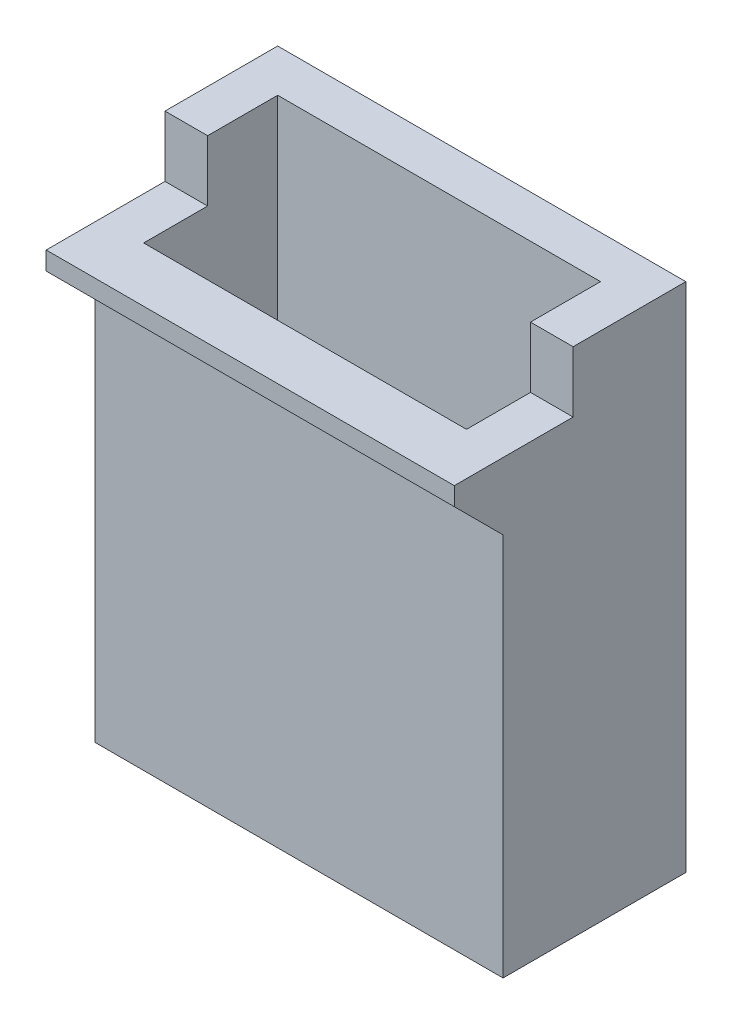
ISO-10303-21;
HEADER;
FILE_DESCRIPTION(('STEP AP214'),'2;1');
FILE_NAME('part.step','',(''),(''),'','','');
FILE_SCHEMA(('AUTOMOTIVE_DESIGN { 1 0 10303 214 1 1 1 1 }'));
ENDSEC;
DATA;
#1=APPLICATION_CONTEXT('core data for automotive mechanical design processes');
#2=APPLICATION_PROTOCOL_DEFINITION('international standard','automotive_design',2000,#1);
#3=PRODUCT_CONTEXT('',#1,'mechanical');
#4=PRODUCT('Part','Part','',(#3));
#5=PRODUCT_RELATED_PRODUCT_CATEGORY('part','',(#4));
#6=PRODUCT_DEFINITION_FORMATION('','',#4);
#7=PRODUCT_DEFINITION_CONTEXT('part definition',#1,'design');
#8=PRODUCT_DEFINITION('design','',#6,#7);
#9=PRODUCT_DEFINITION_SHAPE('','',#8);
#10=(LENGTH_UNIT() NAMED_UNIT(*) SI_UNIT(.MILLI.,.METRE.));
#11=(NAMED_UNIT(*) PLANE_ANGLE_UNIT() SI_UNIT($,.RADIAN.));
#12=(NAMED_UNIT(*) SI_UNIT($,.STERADIAN.) SOLID_ANGLE_UNIT());
#13=UNCERTAINTY_MEASURE_WITH_UNIT(LENGTH_MEASURE(1.E-05),#10,'distance_accuracy_value','');
#14=(GEOMETRIC_REPRESENTATION_CONTEXT(3) GLOBAL_UNCERTAINTY_ASSIGNED_CONTEXT((#13)) GLOBAL_UNIT_ASSIGNED_CONTEXT((#10,
#11,#12)) REPRESENTATION_CONTEXT('',''));
#15=CARTESIAN_POINT('',(0.,0.,0.));
#16=DIRECTION('',(0.,0.,1.));
#17=DIRECTION('',(1.,0.,0.));
#18=AXIS2_PLACEMENT_3D('',#15,#16,#17);
#19=CARTESIAN_POINT('',(0.,0.,-1.5));
#20=DIRECTION('',(0.,0.,1.));
#21=DIRECTION('',(1.,0.,0.));
#22=AXIS2_PLACEMENT_3D('',#19,#20,#21);
#23=PLANE('',#22);
#24=DIRECTION('',(-1.,0.,0.));
#25=VECTOR('',#24,1.);
#26=CARTESIAN_POINT('',(3.35,4.2,-1.5));
#27=LINE('',#26,#25);
#28=CARTESIAN_POINT('',(3.35,4.2,-1.5));
#29=VERTEX_POINT('',#28);
#30=CARTESIAN_POINT('',(-3.35,4.2,-1.5));
#31=VERTEX_POINT('',#30);
#32=EDGE_CURVE('E36',#29,#31,#27,.T.);
#33=ORIENTED_EDGE('',*,*,#32,.F.);
#34=DIRECTION('',(0.,1.,0.));
#35=VECTOR('',#34,1.);
#36=CARTESIAN_POINT('',(3.35,-4.2,-1.5));
#37=LINE('',#36,#35);
#38=CARTESIAN_POINT('',(3.35,-4.2,-1.5));
#39=VERTEX_POINT('',#38);
#40=EDGE_CURVE('E269',#39,#29,#37,.T.);
#41=ORIENTED_EDGE('',*,*,#40,.F.);
#42=DIRECTION('',(1.,0.,0.));
#43=VECTOR('',#42,1.);
#44=CARTESIAN_POINT('',(-3.35,-4.2,-1.5));
#45=LINE('',#44,#43);
#46=CARTESIAN_POINT('',(-3.35,-4.2,-1.5));
#47=VERTEX_POINT('',#46);
#48=EDGE_CURVE('E237',#47,#39,#45,.T.);
#49=ORIENTED_EDGE('',*,*,#48,.F.);
#50=DIRECTION('',(0.,-1.,0.));
#51=VECTOR('',#50,1.);
#52=CARTESIAN_POINT('',(-3.35,4.2,-1.5));
#53=LINE('',#52,#51);
#54=EDGE_CURVE('E11',#31,#47,#53,.T.);
#55=ORIENTED_EDGE('',*,*,#54,.F.);
#56=EDGE_LOOP('',(#33,#41,#49,#55));
#57=FACE_BOUND('',#56,.T.);
#58=ADVANCED_FACE('F17',(#57),#23,.F.);
#59=CARTESIAN_POINT('',(-3.35,4.2,-1.5));
#60=DIRECTION('',(-1.,0.,0.));
#61=DIRECTION('',(0.,-1.,0.));
#62=AXIS2_PLACEMENT_3D('',#59,#60,#61);
#63=PLANE('',#62);
#64=DIRECTION('',(0.,-1.,0.));
#65=VECTOR('',#64,1.);
#66=CARTESIAN_POINT('',(-3.35,4.2,0.35));
#67=LINE('',#66,#65);
#68=CARTESIAN_POINT('',(-3.35,4.2,0.35));
#69=VERTEX_POINT('',#68);
#70=CARTESIAN_POINT('',(-3.35,3.2,0.35));
#71=VERTEX_POINT('',#70);
#72=EDGE_CURVE('E199',#69,#71,#67,.T.);
#73=ORIENTED_EDGE('',*,*,#72,.F.);
#74=DIRECTION('',(0.,0.,1.));
#75=VECTOR('',#74,1.);
#76=CARTESIAN_POINT('',(-3.35,4.2,-1.5));
#77=LINE('',#76,#75);
#78=EDGE_CURVE('E297',#31,#69,#77,.T.);
#79=ORIENTED_EDGE('',*,*,#78,.F.);
#80=ORIENTED_EDGE('',*,*,#54,.T.);
#81=DIRECTION('',(0.,0.,1.));
#82=VECTOR('',#81,1.);
#83=CARTESIAN_POINT('',(-3.35,-4.2,-1.5));
#84=LINE('',#83,#82);
#85=CARTESIAN_POINT('',(-3.35,-4.2,1.5));
#86=VERTEX_POINT('',#85);
#87=EDGE_CURVE('E27',#47,#86,#84,.T.);
#88=ORIENTED_EDGE('',*,*,#87,.T.);
#89=DIRECTION('',(0.,-1.,0.));
#90=VECTOR('',#89,1.);
#91=CARTESIAN_POINT('',(-3.35,2.1,1.5));
#92=LINE('',#91,#90);
#93=CARTESIAN_POINT('',(-3.35,2.1,1.5));
#94=VERTEX_POINT('',#93);
#95=EDGE_CURVE('E240',#94,#86,#92,.T.);
#96=ORIENTED_EDGE('',*,*,#95,.F.);
#97=DIRECTION('',(0.,-0.707106781186548,-0.707106781186548));
#98=VECTOR('',#97,1.);
#99=CARTESIAN_POINT('',(-3.35,2.9,2.3));
#100=LINE('',#99,#98);
#101=CARTESIAN_POINT('',(-3.35,2.9,2.3));
#102=VERTEX_POINT('',#101);
#103=EDGE_CURVE('E254',#102,#94,#100,.T.);
#104=ORIENTED_EDGE('',*,*,#103,.F.);
#105=DIRECTION('',(0.,-1.,0.));
#106=VECTOR('',#105,1.);
#107=CARTESIAN_POINT('',(-3.35,3.2,2.3));
#108=LINE('',#107,#106);
#109=CARTESIAN_POINT('',(-3.35,3.2,2.3));
#110=VERTEX_POINT('',#109);
#111=EDGE_CURVE('E314',#110,#102,#108,.T.);
#112=ORIENTED_EDGE('',*,*,#111,.F.);
#113=DIRECTION('',(0.,0.,1.));
#114=VECTOR('',#113,1.);
#115=CARTESIAN_POINT('',(-3.35,3.2,0.35));
#116=LINE('',#115,#114);
#117=EDGE_CURVE('E316',#71,#110,#116,.T.);
#118=ORIENTED_EDGE('',*,*,#117,.F.);
#119=EDGE_LOOP('',(#73,#79,#80,#88,#96,#104,#112,#118));
#120=FACE_BOUND('',#119,.T.);
#121=ADVANCED_FACE('F410',(#120),#63,.T.);
#122=CARTESIAN_POINT('',(3.35,3.2,1.5));
#123=DIRECTION('',(0.,-1.,0.));
#124=DIRECTION('',(0.,0.,-1.));
#125=AXIS2_PLACEMENT_3D('',#122,#123,#124);
#126=PLANE('',#125);
#127=DIRECTION('',(0.,0.,-1.));
#128=VECTOR('',#127,1.);
#129=CARTESIAN_POINT('',(-2.65,3.2,1.4));
#130=LINE('',#129,#128);
#131=CARTESIAN_POINT('',(-2.65,3.2,1.4));
#132=VERTEX_POINT('',#131);
#133=CARTESIAN_POINT('',(-2.65,3.2,0.35));
#134=VERTEX_POINT('',#133);
#135=EDGE_CURVE('E311',#132,#134,#130,.T.);
#136=ORIENTED_EDGE('',*,*,#135,.T.);
#137=DIRECTION('',(-1.,0.,0.));
#138=VECTOR('',#137,1.);
#139=CARTESIAN_POINT('',(-2.65,3.2,0.35));
#140=LINE('',#139,#138);
#141=EDGE_CURVE('E319',#134,#71,#140,.T.);
#142=ORIENTED_EDGE('',*,*,#141,.T.);
#143=ORIENTED_EDGE('',*,*,#117,.T.);
#144=DIRECTION('',(-1.,0.,0.));
#145=VECTOR('',#144,1.);
#146=CARTESIAN_POINT('',(3.35,3.2,2.3));
#147=LINE('',#146,#145);
#148=CARTESIAN_POINT('',(3.35,3.2,2.3));
#149=VERTEX_POINT('',#148);
#150=EDGE_CURVE('E255',#149,#110,#147,.T.);
#151=ORIENTED_EDGE('',*,*,#150,.F.);
#152=DIRECTION('',(0.,0.,1.));
#153=VECTOR('',#152,1.);
#154=CARTESIAN_POINT('',(3.35,3.2,0.35));
#155=LINE('',#154,#153);
#156=CARTESIAN_POINT('',(3.35,3.2,0.35));
#157=VERTEX_POINT('',#156);
#158=EDGE_CURVE('E264',#157,#149,#155,.T.);
#159=ORIENTED_EDGE('',*,*,#158,.F.);
#160=DIRECTION('',(-1.,0.,0.));
#161=VECTOR('',#160,1.);
#162=CARTESIAN_POINT('',(3.35,3.2,0.35));
#163=LINE('',#162,#161);
#164=CARTESIAN_POINT('',(2.65,3.2,0.35));
#165=VERTEX_POINT('',#164);
#166=EDGE_CURVE('E320',#157,#165,#163,.T.);
#167=ORIENTED_EDGE('',*,*,#166,.T.);
#168=DIRECTION('',(0.,0.,1.));
#169=VECTOR('',#168,1.);
#170=CARTESIAN_POINT('',(2.65,3.2,0.35));
#171=LINE('',#170,#169);
#172=CARTESIAN_POINT('',(2.65,3.2,1.4));
#173=VERTEX_POINT('',#172);
#174=EDGE_CURVE('E330',#165,#173,#171,.T.);
#175=ORIENTED_EDGE('',*,*,#174,.T.);
#176=DIRECTION('',(1.,0.,0.));
#177=VECTOR('',#176,1.);
#178=CARTESIAN_POINT('',(-2.65,3.2,1.4));
#179=LINE('',#178,#177);
#180=EDGE_CURVE('E334',#132,#173,#179,.T.);
#181=ORIENTED_EDGE('',*,*,#180,.F.);
#182=EDGE_LOOP('',(#136,#142,#143,#151,#159,#167,#175,#181));
#183=FACE_BOUND('',#182,.T.);
#184=ADVANCED_FACE('F422',(#183),#126,.F.);
#185=CARTESIAN_POINT('',(0.,2.9,1.1));
#186=DIRECTION('',(0.,0.707106781186548,-0.707106781186548));
#187=DIRECTION('',(0.,0.707106781186548,0.707106781186548));
#188=AXIS2_PLACEMENT_3D('',#185,#186,#187);
#189=PLANE('',#188);
#190=DIRECTION('',(0.,-0.707106781186548,-0.707106781186548));
#191=VECTOR('',#190,1.);
#192=CARTESIAN_POINT('',(2.65,3.2,1.4));
#193=LINE('',#192,#191);
#194=CARTESIAN_POINT('',(2.65,2.6,0.8));
#195=VERTEX_POINT('',#194);
#196=EDGE_CURVE('E333',#173,#195,#193,.T.);
#197=ORIENTED_EDGE('',*,*,#196,.T.);
#198=DIRECTION('',(1.,0.,0.));
#199=VECTOR('',#198,1.);
#200=CARTESIAN_POINT('',(-2.65,2.6,0.8));
#201=LINE('',#200,#199);
#202=CARTESIAN_POINT('',(-2.65,2.6,0.8));
#203=VERTEX_POINT('',#202);
#204=EDGE_CURVE('E340',#203,#195,#201,.T.);
#205=ORIENTED_EDGE('',*,*,#204,.F.);
#206=DIRECTION('',(0.,0.707106781186548,0.707106781186548));
#207=VECTOR('',#206,1.);
#208=CARTESIAN_POINT('',(-2.65,2.6,0.8));
#209=LINE('',#208,#207);
#210=EDGE_CURVE('E336',#203,#132,#209,.T.);
#211=ORIENTED_EDGE('',*,*,#210,.T.);
#212=ORIENTED_EDGE('',*,*,#180,.T.);
#213=EDGE_LOOP('',(#197,#205,#211,#212));
#214=FACE_BOUND('',#213,.T.);
#215=ADVANCED_FACE('F420',(#214),#189,.T.);
#216=CARTESIAN_POINT('',(-2.65,4.2,-1.5));
#217=DIRECTION('',(-1.,0.,0.));
#218=DIRECTION('',(0.,-1.,0.));
#219=AXIS2_PLACEMENT_3D('',#216,#217,#218);
#220=PLANE('',#219);
#221=DIRECTION('',(0.,0.,1.));
#222=VECTOR('',#221,1.);
#223=CARTESIAN_POINT('',(-2.65,-3.5,-0.8));
#224=LINE('',#223,#222);
#225=CARTESIAN_POINT('',(-2.65,-3.5,-0.8));
#226=VERTEX_POINT('',#225);
#227=CARTESIAN_POINT('',(-2.65,-3.5,0.8));
#228=VERTEX_POINT('',#227);
#229=EDGE_CURVE('E211',#226,#228,#224,.T.);
#230=ORIENTED_EDGE('',*,*,#229,.F.);
#231=DIRECTION('',(0.,-1.,0.));
#232=VECTOR('',#231,1.);
#233=CARTESIAN_POINT('',(-2.65,4.2,-0.8));
#234=LINE('',#233,#232);
#235=CARTESIAN_POINT('',(-2.65,4.2,-0.8));
#236=VERTEX_POINT('',#235);
#237=EDGE_CURVE('E223',#236,#226,#234,.T.);
#238=ORIENTED_EDGE('',*,*,#237,.F.);
#239=DIRECTION('',(0.,0.,1.));
#240=VECTOR('',#239,1.);
#241=CARTESIAN_POINT('',(-2.65,4.2,-0.8));
#242=LINE('',#241,#240);
#243=CARTESIAN_POINT('',(-2.65,4.2,0.35));
#244=VERTEX_POINT('',#243);
#245=EDGE_CURVE('E337',#236,#244,#242,.T.);
#246=ORIENTED_EDGE('',*,*,#245,.T.);
#247=DIRECTION('',(0.,-1.,0.));
#248=VECTOR('',#247,1.);
#249=CARTESIAN_POINT('',(-2.65,4.2,0.35));
#250=LINE('',#249,#248);
#251=EDGE_CURVE('E350',#244,#134,#250,.T.);
#252=ORIENTED_EDGE('',*,*,#251,.T.);
#253=ORIENTED_EDGE('',*,*,#135,.F.);
#254=ORIENTED_EDGE('',*,*,#210,.F.);
#255=DIRECTION('',(0.,-1.,0.));
#256=VECTOR('',#255,1.);
#257=CARTESIAN_POINT('',(-2.65,2.6,0.8));
#258=LINE('',#257,#256);
#259=EDGE_CURVE('E342',#203,#228,#258,.T.);
#260=ORIENTED_EDGE('',*,*,#259,.T.);
#261=EDGE_LOOP('',(#230,#238,#246,#252,#253,#254,#260));
#262=FACE_BOUND('',#261,.T.);
#263=ADVANCED_FACE('F416',(#262),#220,.F.);
#264=CARTESIAN_POINT('',(0.,0.,0.8));
#265=DIRECTION('',(0.,0.,1.));
#266=DIRECTION('',(1.,0.,0.));
#267=AXIS2_PLACEMENT_3D('',#264,#265,#266);
#268=PLANE('',#267);
#269=ORIENTED_EDGE('',*,*,#259,.F.);
#270=ORIENTED_EDGE('',*,*,#204,.T.);
#271=DIRECTION('',(0.,1.,0.));
#272=VECTOR('',#271,1.);
#273=CARTESIAN_POINT('',(2.65,-3.5,0.8));
#274=LINE('',#273,#272);
#275=CARTESIAN_POINT('',(2.65,-3.5,0.8));
#276=VERTEX_POINT('',#275);
#277=EDGE_CURVE('E287',#276,#195,#274,.T.);
#278=ORIENTED_EDGE('',*,*,#277,.F.);
#279=DIRECTION('',(1.,0.,0.));
#280=VECTOR('',#279,1.);
#281=CARTESIAN_POINT('',(1.4,-3.5,0.8));
#282=LINE('',#281,#280);
#283=CARTESIAN_POINT('',(1.4,-3.5,0.8));
#284=VERTEX_POINT('',#283);
#285=EDGE_CURVE('E294',#284,#276,#282,.T.);
#286=ORIENTED_EDGE('',*,*,#285,.F.);
#287=DIRECTION('',(0.,1.,0.));
#288=VECTOR('',#287,1.);
#289=CARTESIAN_POINT('',(1.4,-4.2,0.8));
#290=LINE('',#289,#288);
#291=CARTESIAN_POINT('',(1.4,-4.2,0.8));
#292=VERTEX_POINT('',#291);
#293=EDGE_CURVE('E245',#292,#284,#290,.T.);
#294=ORIENTED_EDGE('',*,*,#293,.F.);
#295=DIRECTION('',(-1.,0.,0.));
#296=VECTOR('',#295,1.);
#297=CARTESIAN_POINT('',(1.4,-4.2,0.8));
#298=LINE('',#297,#296);
#299=CARTESIAN_POINT('',(-1.4,-4.2,0.8));
#300=VERTEX_POINT('',#299);
#301=EDGE_CURVE('E343',#292,#300,#298,.T.);
#302=ORIENTED_EDGE('',*,*,#301,.T.);
#303=DIRECTION('',(0.,1.,0.));
#304=VECTOR('',#303,1.);
#305=CARTESIAN_POINT('',(-1.4,-4.2,0.8));
#306=LINE('',#305,#304);
#307=CARTESIAN_POINT('',(-1.4,-3.5,0.8));
#308=VERTEX_POINT('',#307);
#309=EDGE_CURVE('E216',#300,#308,#306,.T.);
#310=ORIENTED_EDGE('',*,*,#309,.T.);
#311=DIRECTION('',(1.,0.,0.));
#312=VECTOR('',#311,1.);
#313=CARTESIAN_POINT('',(-2.65,-3.5,0.8));
#314=LINE('',#313,#312);
#315=EDGE_CURVE('E232',#228,#308,#314,.T.);
#316=ORIENTED_EDGE('',*,*,#315,.F.);
#317=EDGE_LOOP('',(#269,#270,#278,#286,#294,#302,#310,#316));
#318=FACE_BOUND('',#317,.T.);
#319=DIRECTION('',(0.,-1.,0.));
#320=VECTOR('',#319,1.);
#321=CARTESIAN_POINT('',(-0.725,0.09999999999996,0.8));
#322=LINE('',#321,#320);
#323=CARTESIAN_POINT('',(-0.725,0.09999999999996,0.8));
#324=VERTEX_POINT('',#323);
#325=CARTESIAN_POINT('',(-0.725,-1.7,0.8));
#326=VERTEX_POINT('',#325);
#327=EDGE_CURVE('E214',#324,#326,#322,.T.);
#328=ORIENTED_EDGE('',*,*,#327,.T.);
#329=DIRECTION('',(1.,0.,0.));
#330=VECTOR('',#329,1.);
#331=CARTESIAN_POINT('',(-0.725,-1.7,0.8));
#332=LINE('',#331,#330);
#333=CARTESIAN_POINT('',(0.725,-1.7,0.8));
#334=VERTEX_POINT('',#333);
#335=EDGE_CURVE('E190',#326,#334,#332,.T.);
#336=ORIENTED_EDGE('',*,*,#335,.T.);
#337=DIRECTION('',(0.,1.,0.));
#338=VECTOR('',#337,1.);
#339=CARTESIAN_POINT('',(0.725,-1.7,0.8));
#340=LINE('',#339,#338);
#341=CARTESIAN_POINT('',(0.725,0.09999999999997,0.8));
#342=VERTEX_POINT('',#341);
#343=EDGE_CURVE('E209',#334,#342,#340,.T.);
#344=ORIENTED_EDGE('',*,*,#343,.T.);
#345=DIRECTION('',(1.,0.,0.));
#346=VECTOR('',#345,1.);
#347=CARTESIAN_POINT('',(-0.725,0.09999999999996,0.8));
#348=LINE('',#347,#346);
#349=EDGE_CURVE('E200',#324,#342,#348,.T.);
#350=ORIENTED_EDGE('',*,*,#349,.F.);
#351=EDGE_LOOP('',(#328,#336,#344,#350));
#352=FACE_BOUND('',#351,.T.);
#353=ADVANCED_FACE('F213',(#318,#352),#268,.F.);
#354=CARTESIAN_POINT('',(-3.35,-3.5,-1.5));
#355=DIRECTION('',(0.,-1.,0.));
#356=DIRECTION('',(1.,0.,0.));
#357=AXIS2_PLACEMENT_3D('',#354,#355,#356);
#358=PLANE('',#357);
#359=DIRECTION('',(1.,0.,0.));
#360=VECTOR('',#359,1.);
#361=CARTESIAN_POINT('',(-2.65,-3.5,-0.8));
#362=LINE('',#361,#360);
#363=CARTESIAN_POINT('',(-1.4,-3.5,-0.8));
#364=VERTEX_POINT('',#363);
#365=EDGE_CURVE('E221',#226,#364,#362,.T.);
#366=ORIENTED_EDGE('',*,*,#365,.F.);
#367=ORIENTED_EDGE('',*,*,#229,.T.);
#368=ORIENTED_EDGE('',*,*,#315,.T.);
#369=DIRECTION('',(0.,0.,1.));
#370=VECTOR('',#369,1.);
#371=CARTESIAN_POINT('',(-1.4,-3.5,-0.8));
#372=LINE('',#371,#370);
#373=EDGE_CURVE('E225',#364,#308,#372,.T.);
#374=ORIENTED_EDGE('',*,*,#373,.F.);
#375=EDGE_LOOP('',(#366,#367,#368,#374));
#376=FACE_BOUND('',#375,.T.);
#377=ADVANCED_FACE('F366',(#376),#358,.F.);
#378=CARTESIAN_POINT('',(-1.4,-4.2,0.8));
#379=DIRECTION('',(-1.,0.,0.));
#380=DIRECTION('',(0.,0.,-1.));
#381=AXIS2_PLACEMENT_3D('',#378,#379,#380);
#382=PLANE('',#381);
#383=DIRECTION('',(0.,1.,0.));
#384=VECTOR('',#383,1.);
#385=CARTESIAN_POINT('',(-1.4,-4.2,-0.8));
#386=LINE('',#385,#384);
#387=CARTESIAN_POINT('',(-1.4,-4.2,-0.8));
#388=VERTEX_POINT('',#387);
#389=EDGE_CURVE('E228',#388,#364,#386,.T.);
#390=ORIENTED_EDGE('',*,*,#389,.T.);
#391=ORIENTED_EDGE('',*,*,#373,.T.);
#392=ORIENTED_EDGE('',*,*,#309,.F.);
#393=DIRECTION('',(0.,0.,-1.));
#394=VECTOR('',#393,1.);
#395=CARTESIAN_POINT('',(-1.4,-4.2,0.8));
#396=LINE('',#395,#394);
#397=EDGE_CURVE('E229',#300,#388,#396,.T.);
#398=ORIENTED_EDGE('',*,*,#397,.T.);
#399=EDGE_LOOP('',(#390,#391,#392,#398));
#400=FACE_BOUND('',#399,.T.);
#401=ADVANCED_FACE('F373',(#400),#382,.F.);
#402=CARTESIAN_POINT('',(-3.35,-4.2,-1.5));
#403=DIRECTION('',(0.,-1.,0.));
#404=DIRECTION('',(1.,0.,0.));
#405=AXIS2_PLACEMENT_3D('',#402,#403,#404);
#406=PLANE('',#405);
#407=DIRECTION('',(0.,0.,1.));
#408=VECTOR('',#407,1.);
#409=CARTESIAN_POINT('',(3.35,-4.2,-1.5));
#410=LINE('',#409,#408);
#411=CARTESIAN_POINT('',(3.35,-4.2,1.5));
#412=VERTEX_POINT('',#411);
#413=EDGE_CURVE('E234',#39,#412,#410,.T.);
#414=ORIENTED_EDGE('',*,*,#413,.T.);
#415=DIRECTION('',(1.,0.,0.));
#416=VECTOR('',#415,1.);
#417=CARTESIAN_POINT('',(-3.35,-4.2,1.5));
#418=LINE('',#417,#416);
#419=EDGE_CURVE('E238',#86,#412,#418,.T.);
#420=ORIENTED_EDGE('',*,*,#419,.F.);
#421=ORIENTED_EDGE('',*,*,#87,.F.);
#422=ORIENTED_EDGE('',*,*,#48,.T.);
#423=EDGE_LOOP('',(#414,#420,#421,#422));
#424=FACE_BOUND('',#423,.T.);
#425=ORIENTED_EDGE('',*,*,#301,.F.);
#426=DIRECTION('',(0.,0.,1.));
#427=VECTOR('',#426,1.);
#428=CARTESIAN_POINT('',(1.4,-4.2,-0.8));
#429=LINE('',#428,#427);
#430=CARTESIAN_POINT('',(1.4,-4.2,-0.8));
#431=VERTEX_POINT('',#430);
#432=EDGE_CURVE('E242',#431,#292,#429,.T.);
#433=ORIENTED_EDGE('',*,*,#432,.F.);
#434=DIRECTION('',(1.,0.,0.));
#435=VECTOR('',#434,1.);
#436=CARTESIAN_POINT('',(-1.4,-4.2,-0.8));
#437=LINE('',#436,#435);
#438=EDGE_CURVE('E224',#388,#431,#437,.T.);
#439=ORIENTED_EDGE('',*,*,#438,.F.);
#440=ORIENTED_EDGE('',*,*,#397,.F.);
#441=EDGE_LOOP('',(#425,#433,#439,#440));
#442=FACE_BOUND('',#441,.T.);
#443=ADVANCED_FACE('F380',(#424,#442),#406,.T.);
#444=CARTESIAN_POINT('',(0.,0.,1.5));
#445=DIRECTION('',(0.,0.,1.));
#446=DIRECTION('',(1.,0.,0.));
#447=AXIS2_PLACEMENT_3D('',#444,#445,#446);
#448=PLANE('',#447);
#449=ORIENTED_EDGE('',*,*,#95,.T.);
#450=ORIENTED_EDGE('',*,*,#419,.T.);
#451=DIRECTION('',(0.,1.,0.));
#452=VECTOR('',#451,1.);
#453=CARTESIAN_POINT('',(3.35,-4.2,1.5));
#454=LINE('',#453,#452);
#455=CARTESIAN_POINT('',(3.35,2.1,1.5));
#456=VERTEX_POINT('',#455);
#457=EDGE_CURVE('E241',#412,#456,#454,.T.);
#458=ORIENTED_EDGE('',*,*,#457,.T.);
#459=DIRECTION('',(1.,0.,0.));
#460=VECTOR('',#459,1.);
#461=CARTESIAN_POINT('',(-3.35,2.1,1.5));
#462=LINE('',#461,#460);
#463=EDGE_CURVE('E252',#94,#456,#462,.T.);
#464=ORIENTED_EDGE('',*,*,#463,.F.);
#465=EDGE_LOOP('',(#449,#450,#458,#464));
#466=FACE_BOUND('',#465,.T.);
#467=ADVANCED_FACE('F433',(#466),#448,.T.);
#468=CARTESIAN_POINT('',(3.35,2.9,2.3));
#469=DIRECTION('',(0.,-0.707106781186548,0.707106781186548));
#470=DIRECTION('',(0.,-0.707106781186548,-0.707106781186548));
#471=AXIS2_PLACEMENT_3D('',#468,#469,#470);
#472=PLANE('',#471);
#473=DIRECTION('',(0.,0.707106781186548,0.707106781186548));
#474=VECTOR('',#473,1.);
#475=CARTESIAN_POINT('',(3.35,2.1,1.5));
#476=LINE('',#475,#474);
#477=CARTESIAN_POINT('',(3.35,2.9,2.3));
#478=VERTEX_POINT('',#477);
#479=EDGE_CURVE('E251',#456,#478,#476,.T.);
#480=ORIENTED_EDGE('',*,*,#479,.T.);
#481=DIRECTION('',(-1.,0.,0.));
#482=VECTOR('',#481,1.);
#483=CARTESIAN_POINT('',(3.35,2.9,2.3));
#484=LINE('',#483,#482);
#485=EDGE_CURVE('E258',#478,#102,#484,.T.);
#486=ORIENTED_EDGE('',*,*,#485,.T.);
#487=ORIENTED_EDGE('',*,*,#103,.T.);
#488=ORIENTED_EDGE('',*,*,#463,.T.);
#489=EDGE_LOOP('',(#480,#486,#487,#488));
#490=FACE_BOUND('',#489,.T.);
#491=ADVANCED_FACE('F430',(#490),#472,.T.);
#492=CARTESIAN_POINT('',(3.35,3.2,2.3));
#493=DIRECTION('',(0.,0.,1.));
#494=DIRECTION('',(0.,-1.,0.));
#495=AXIS2_PLACEMENT_3D('',#492,#493,#494);
#496=PLANE('',#495);
#497=ORIENTED_EDGE('',*,*,#150,.T.);
#498=ORIENTED_EDGE('',*,*,#111,.T.);
#499=ORIENTED_EDGE('',*,*,#485,.F.);
#500=DIRECTION('',(0.,-1.,0.));
#501=VECTOR('',#500,1.);
#502=CARTESIAN_POINT('',(3.35,3.2,2.3));
#503=LINE('',#502,#501);
#504=EDGE_CURVE('E261',#149,#478,#503,.T.);
#505=ORIENTED_EDGE('',*,*,#504,.F.);
#506=EDGE_LOOP('',(#497,#498,#499,#505));
#507=FACE_BOUND('',#506,.T.);
#508=ADVANCED_FACE('F427',(#507),#496,.T.);
#509=CARTESIAN_POINT('',(3.35,-4.2,-1.5));
#510=DIRECTION('',(1.,0.,0.));
#511=DIRECTION('',(0.,1.,0.));
#512=AXIS2_PLACEMENT_3D('',#509,#510,#511);
#513=PLANE('',#512);
#514=ORIENTED_EDGE('',*,*,#413,.F.);
#515=ORIENTED_EDGE('',*,*,#40,.T.);
#516=DIRECTION('',(0.,0.,1.));
#517=VECTOR('',#516,1.);
#518=CARTESIAN_POINT('',(3.35,4.2,-1.5));
#519=LINE('',#518,#517);
#520=CARTESIAN_POINT('',(3.35,4.2,0.35));
#521=VERTEX_POINT('',#520);
#522=EDGE_CURVE('E266',#29,#521,#519,.T.);
#523=ORIENTED_EDGE('',*,*,#522,.T.);
#524=DIRECTION('',(0.,-1.,0.));
#525=VECTOR('',#524,1.);
#526=CARTESIAN_POINT('',(3.35,4.2,0.35));
#527=LINE('',#526,#525);
#528=EDGE_CURVE('E270',#521,#157,#527,.T.);
#529=ORIENTED_EDGE('',*,*,#528,.T.);
#530=ORIENTED_EDGE('',*,*,#158,.T.);
#531=ORIENTED_EDGE('',*,*,#504,.T.);
#532=ORIENTED_EDGE('',*,*,#479,.F.);
#533=ORIENTED_EDGE('',*,*,#457,.F.);
#534=EDGE_LOOP('',(#514,#515,#523,#529,#530,#531,#532,#533));
#535=FACE_BOUND('',#534,.T.);
#536=ADVANCED_FACE('F401',(#535),#513,.T.);
#537=CARTESIAN_POINT('',(3.35,3.2,0.35));
#538=DIRECTION('',(0.,0.,-1.));
#539=DIRECTION('',(0.,1.,0.));
#540=AXIS2_PLACEMENT_3D('',#537,#538,#539);
#541=PLANE('',#540);
#542=DIRECTION('',(-1.,0.,0.));
#543=VECTOR('',#542,1.);
#544=CARTESIAN_POINT('',(3.35,4.2,0.35));
#545=LINE('',#544,#543);
#546=CARTESIAN_POINT('',(2.65,4.2,0.35));
#547=VERTEX_POINT('',#546);
#548=EDGE_CURVE('E265',#521,#547,#545,.T.);
#549=ORIENTED_EDGE('',*,*,#548,.T.);
#550=DIRECTION('',(0.,-1.,0.));
#551=VECTOR('',#550,1.);
#552=CARTESIAN_POINT('',(2.65,4.2,0.35));
#553=LINE('',#552,#551);
#554=EDGE_CURVE('E275',#547,#165,#553,.T.);
#555=ORIENTED_EDGE('',*,*,#554,.T.);
#556=ORIENTED_EDGE('',*,*,#166,.F.);
#557=ORIENTED_EDGE('',*,*,#528,.F.);
#558=EDGE_LOOP('',(#549,#555,#556,#557));
#559=FACE_BOUND('',#558,.T.);
#560=ADVANCED_FACE('F397',(#559),#541,.F.);
#561=CARTESIAN_POINT('',(2.65,-4.2,-1.5));
#562=DIRECTION('',(1.,0.,0.));
#563=DIRECTION('',(0.,1.,0.));
#564=AXIS2_PLACEMENT_3D('',#561,#562,#563);
#565=PLANE('',#564);
#566=ORIENTED_EDGE('',*,*,#554,.F.);
#567=DIRECTION('',(0.,0.,1.));
#568=VECTOR('',#567,1.);
#569=CARTESIAN_POINT('',(2.65,4.2,-0.8));
#570=LINE('',#569,#568);
#571=CARTESIAN_POINT('',(2.65,4.2,-0.8));
#572=VERTEX_POINT('',#571);
#573=EDGE_CURVE('E279',#572,#547,#570,.T.);
#574=ORIENTED_EDGE('',*,*,#573,.F.);
#575=DIRECTION('',(0.,1.,0.));
#576=VECTOR('',#575,1.);
#577=CARTESIAN_POINT('',(2.65,-3.5,-0.8));
#578=LINE('',#577,#576);
#579=CARTESIAN_POINT('',(2.65,-3.5,-0.8));
#580=VERTEX_POINT('',#579);
#581=EDGE_CURVE('E246',#580,#572,#578,.T.);
#582=ORIENTED_EDGE('',*,*,#581,.F.);
#583=DIRECTION('',(0.,0.,1.));
#584=VECTOR('',#583,1.);
#585=CARTESIAN_POINT('',(2.65,-3.5,-0.8));
#586=LINE('',#585,#584);
#587=EDGE_CURVE('E278',#580,#276,#586,.T.);
#588=ORIENTED_EDGE('',*,*,#587,.T.);
#589=ORIENTED_EDGE('',*,*,#277,.T.);
#590=ORIENTED_EDGE('',*,*,#196,.F.);
#591=ORIENTED_EDGE('',*,*,#174,.F.);
#592=EDGE_LOOP('',(#566,#574,#582,#588,#589,#590,#591));
#593=FACE_BOUND('',#592,.T.);
#594=ADVANCED_FACE('F391',(#593),#565,.F.);
#595=CARTESIAN_POINT('',(-3.35,-3.5,-1.5));
#596=DIRECTION('',(0.,-1.,0.));
#597=DIRECTION('',(1.,0.,0.));
#598=AXIS2_PLACEMENT_3D('',#595,#596,#597);
#599=PLANE('',#598);
#600=ORIENTED_EDGE('',*,*,#285,.T.);
#601=ORIENTED_EDGE('',*,*,#587,.F.);
#602=DIRECTION('',(1.,0.,0.));
#603=VECTOR('',#602,1.);
#604=CARTESIAN_POINT('',(1.4,-3.5,-0.8));
#605=LINE('',#604,#603);
#606=CARTESIAN_POINT('',(1.4,-3.5,-0.8));
#607=VERTEX_POINT('',#606);
#608=EDGE_CURVE('E288',#607,#580,#605,.T.);
#609=ORIENTED_EDGE('',*,*,#608,.F.);
#610=DIRECTION('',(0.,0.,1.));
#611=VECTOR('',#610,1.);
#612=CARTESIAN_POINT('',(1.4,-3.5,-0.8));
#613=LINE('',#612,#611);
#614=EDGE_CURVE('E291',#607,#284,#613,.T.);
#615=ORIENTED_EDGE('',*,*,#614,.T.);
#616=EDGE_LOOP('',(#600,#601,#609,#615));
#617=FACE_BOUND('',#616,.T.);
#618=ADVANCED_FACE('F387',(#617),#599,.F.);
#619=CARTESIAN_POINT('',(1.4,-4.2,-0.8));
#620=DIRECTION('',(1.,0.,0.));
#621=DIRECTION('',(0.,0.,1.));
#622=AXIS2_PLACEMENT_3D('',#619,#620,#621);
#623=PLANE('',#622);
#624=ORIENTED_EDGE('',*,*,#293,.T.);
#625=ORIENTED_EDGE('',*,*,#614,.F.);
#626=DIRECTION('',(0.,1.,0.));
#627=VECTOR('',#626,1.);
#628=CARTESIAN_POINT('',(1.4,-4.2,-0.8));
#629=LINE('',#628,#627);
#630=EDGE_CURVE('E248',#431,#607,#629,.T.);
#631=ORIENTED_EDGE('',*,*,#630,.F.);
#632=ORIENTED_EDGE('',*,*,#432,.T.);
#633=EDGE_LOOP('',(#624,#625,#631,#632));
#634=FACE_BOUND('',#633,.T.);
#635=ADVANCED_FACE('F384',(#634),#623,.F.);
#636=CARTESIAN_POINT('',(0.,0.,-0.8));
#637=DIRECTION('',(0.,0.,1.));
#638=DIRECTION('',(1.,0.,0.));
#639=AXIS2_PLACEMENT_3D('',#636,#637,#638);
#640=PLANE('',#639);
#641=ORIENTED_EDGE('',*,*,#581,.T.);
#642=DIRECTION('',(1.,0.,0.));
#643=VECTOR('',#642,1.);
#644=CARTESIAN_POINT('',(-2.65,4.2,-0.8));
#645=LINE('',#644,#643);
#646=EDGE_CURVE('E282',#236,#572,#645,.T.);
#647=ORIENTED_EDGE('',*,*,#646,.F.);
#648=ORIENTED_EDGE('',*,*,#237,.T.);
#649=ORIENTED_EDGE('',*,*,#365,.T.);
#650=ORIENTED_EDGE('',*,*,#389,.F.);
#651=ORIENTED_EDGE('',*,*,#438,.T.);
#652=ORIENTED_EDGE('',*,*,#630,.T.);
#653=ORIENTED_EDGE('',*,*,#608,.T.);
#654=EDGE_LOOP('',(#641,#647,#648,#649,#650,#651,#652,#653));
#655=FACE_BOUND('',#654,.T.);
#656=ADVANCED_FACE('F377',(#655),#640,.T.);
#657=CARTESIAN_POINT('',(3.35,4.2,-1.5));
#658=DIRECTION('',(0.,1.,0.));
#659=DIRECTION('',(-1.,0.,0.));
#660=AXIS2_PLACEMENT_3D('',#657,#658,#659);
#661=PLANE('',#660);
#662=ORIENTED_EDGE('',*,*,#522,.F.);
#663=ORIENTED_EDGE('',*,*,#32,.T.);
#664=ORIENTED_EDGE('',*,*,#78,.T.);
#665=DIRECTION('',(-1.,0.,0.));
#666=VECTOR('',#665,1.);
#667=CARTESIAN_POINT('',(-2.65,4.2,0.35));
#668=LINE('',#667,#666);
#669=EDGE_CURVE('E196',#244,#69,#668,.T.);
#670=ORIENTED_EDGE('',*,*,#669,.F.);
#671=ORIENTED_EDGE('',*,*,#245,.F.);
#672=ORIENTED_EDGE('',*,*,#646,.T.);
#673=ORIENTED_EDGE('',*,*,#573,.T.);
#674=ORIENTED_EDGE('',*,*,#548,.F.);
#675=EDGE_LOOP('',(#662,#663,#664,#670,#671,#672,#673,#674));
#676=FACE_BOUND('',#675,.T.);
#677=ADVANCED_FACE('F395',(#676),#661,.T.);
#678=CARTESIAN_POINT('',(3.35,3.2,0.35));
#679=DIRECTION('',(0.,0.,-1.));
#680=DIRECTION('',(0.,1.,0.));
#681=AXIS2_PLACEMENT_3D('',#678,#679,#680);
#682=PLANE('',#681);
#683=ORIENTED_EDGE('',*,*,#141,.F.);
#684=ORIENTED_EDGE('',*,*,#251,.F.);
#685=ORIENTED_EDGE('',*,*,#669,.T.);
#686=ORIENTED_EDGE('',*,*,#72,.T.);
#687=EDGE_LOOP('',(#683,#684,#685,#686));
#688=FACE_BOUND('',#687,.T.);
#689=ADVANCED_FACE('F414',(#688),#682,.F.);
#690=CARTESIAN_POINT('',(0.,-0.45,0.45));
#691=DIRECTION('',(0.,0.536875492193192,-0.843661487732087));
#692=DIRECTION('',(0.,0.843661487732087,0.536875492193192));
#693=AXIS2_PLACEMENT_3D('',#690,#691,#692);
#694=PLANE('',#693);
#695=DIRECTION('',(1.,0.,0.));
#696=VECTOR('',#695,1.);
#697=CARTESIAN_POINT('',(-0.725,-1.,0.09999999999999));
#698=LINE('',#697,#696);
#699=CARTESIAN_POINT('',(-0.725,-1.,0.09999999999999));
#700=VERTEX_POINT('',#699);
#701=CARTESIAN_POINT('',(0.725,-1.,0.09999999999999));
#702=VERTEX_POINT('',#701);
#703=EDGE_CURVE('E183',#700,#702,#698,.T.);
#704=ORIENTED_EDGE('',*,*,#703,.F.);
#705=DIRECTION('',(0.,0.843661487732087,0.536875492193192));
#706=VECTOR('',#705,1.);
#707=CARTESIAN_POINT('',(-0.725,-1.,0.09999999999999));
#708=LINE('',#707,#706);
#709=EDGE_CURVE('E181',#700,#324,#708,.T.);
#710=ORIENTED_EDGE('',*,*,#709,.T.);
#711=ORIENTED_EDGE('',*,*,#349,.T.);
#712=DIRECTION('',(0.,-0.843661487732087,-0.536875492193192));
#713=VECTOR('',#712,1.);
#714=CARTESIAN_POINT('',(0.725,0.09999999999997,0.8));
#715=LINE('',#714,#713);
#716=EDGE_CURVE('E201',#342,#702,#715,.T.);
#717=ORIENTED_EDGE('',*,*,#716,.T.);
#718=EDGE_LOOP('',(#704,#710,#711,#717));
#719=FACE_BOUND('',#718,.T.);
#720=ADVANCED_FACE('F557',(#719),#694,.T.);
#721=CARTESIAN_POINT('',(0.725,-1.7,0.8));
#722=DIRECTION('',(1.,0.,0.));
#723=DIRECTION('',(0.,1.,0.));
#724=AXIS2_PLACEMENT_3D('',#721,#722,#723);
#725=PLANE('',#724);
#726=ORIENTED_EDGE('',*,*,#343,.F.);
#727=DIRECTION('',(0.,0.,-1.));
#728=VECTOR('',#727,1.);
#729=CARTESIAN_POINT('',(0.725,-1.7,0.8));
#730=LINE('',#729,#728);
#731=CARTESIAN_POINT('',(0.725,-1.7,0.1));
#732=VERTEX_POINT('',#731);
#733=EDGE_CURVE('E203',#334,#732,#730,.T.);
#734=ORIENTED_EDGE('',*,*,#733,.T.);
#735=DIRECTION('',(0.,-1.,0.));
#736=VECTOR('',#735,1.);
#737=CARTESIAN_POINT('',(0.725,-1.,0.09999999999999));
#738=LINE('',#737,#736);
#739=EDGE_CURVE('E169',#702,#732,#738,.T.);
#740=ORIENTED_EDGE('',*,*,#739,.F.);
#741=ORIENTED_EDGE('',*,*,#716,.F.);
#742=EDGE_LOOP('',(#726,#734,#740,#741));
#743=FACE_BOUND('',#742,.T.);
#744=ADVANCED_FACE('F206',(#743),#725,.T.);
#745=CARTESIAN_POINT('',(0.,0.,0.1));
#746=DIRECTION('',(0.,0.,1.));
#747=DIRECTION('',(-1.,0.,0.));
#748=AXIS2_PLACEMENT_3D('',#745,#746,#747);
#749=PLANE('',#748);
#750=ORIENTED_EDGE('',*,*,#739,.T.);
#751=DIRECTION('',(-1.,0.,0.));
#752=VECTOR('',#751,1.);
#753=CARTESIAN_POINT('',(0.725,-1.7,0.1));
#754=LINE('',#753,#752);
#755=CARTESIAN_POINT('',(-0.725,-1.7,0.1));
#756=VERTEX_POINT('',#755);
#757=EDGE_CURVE('E182',#732,#756,#754,.T.);
#758=ORIENTED_EDGE('',*,*,#757,.T.);
#759=DIRECTION('',(0.,1.,0.));
#760=VECTOR('',#759,1.);
#761=CARTESIAN_POINT('',(-0.725,-1.7,0.1));
#762=LINE('',#761,#760);
#763=EDGE_CURVE('E176',#756,#700,#762,.T.);
#764=ORIENTED_EDGE('',*,*,#763,.T.);
#765=ORIENTED_EDGE('',*,*,#703,.T.);
#766=EDGE_LOOP('',(#750,#758,#764,#765));
#767=FACE_BOUND('',#766,.T.);
#768=ADVANCED_FACE('F185',(#767),#749,.F.);
#769=CARTESIAN_POINT('',(-0.725,0.1,0.8));
#770=DIRECTION('',(-1.,0.,0.));
#771=DIRECTION('',(0.,-1.,0.));
#772=AXIS2_PLACEMENT_3D('',#769,#770,#771);
#773=PLANE('',#772);
#774=ORIENTED_EDGE('',*,*,#763,.F.);
#775=DIRECTION('',(0.,0.,-1.));
#776=VECTOR('',#775,1.);
#777=CARTESIAN_POINT('',(-0.725,-1.7,0.8));
#778=LINE('',#777,#776);
#779=EDGE_CURVE('E21',#326,#756,#778,.T.);
#780=ORIENTED_EDGE('',*,*,#779,.F.);
#781=ORIENTED_EDGE('',*,*,#327,.F.);
#782=ORIENTED_EDGE('',*,*,#709,.F.);
#783=EDGE_LOOP('',(#774,#780,#781,#782));
#784=FACE_BOUND('',#783,.T.);
#785=ADVANCED_FACE('F177',(#784),#773,.T.);
#786=CARTESIAN_POINT('',(-0.725,-1.7,0.8));
#787=DIRECTION('',(0.,-1.,0.));
#788=DIRECTION('',(1.,0.,0.));
#789=AXIS2_PLACEMENT_3D('',#786,#787,#788);
#790=PLANE('',#789);
#791=ORIENTED_EDGE('',*,*,#779,.T.);
#792=ORIENTED_EDGE('',*,*,#757,.F.);
#793=ORIENTED_EDGE('',*,*,#733,.F.);
#794=ORIENTED_EDGE('',*,*,#335,.F.);
#795=EDGE_LOOP('',(#791,#792,#793,#794));
#796=FACE_BOUND('',#795,.T.);
#797=ADVANCED_FACE('F19',(#796),#790,.T.);
#798=CLOSED_SHELL('',(#58,#121,#184,#215,#263,#353,#377,#401,#443,#467,#491,#508,#536,#560,#594,
#618,#635,#656,#677,#689,#720,#744,#768,#785,#797));
#799=MANIFOLD_SOLID_BREP('B1',#798);
#800=ADVANCED_BREP_SHAPE_REPRESENTATION('',(#18,#799),#14);
#801=SHAPE_DEFINITION_REPRESENTATION(#9,#800);
ENDSEC;
END-ISO-10303-21;
